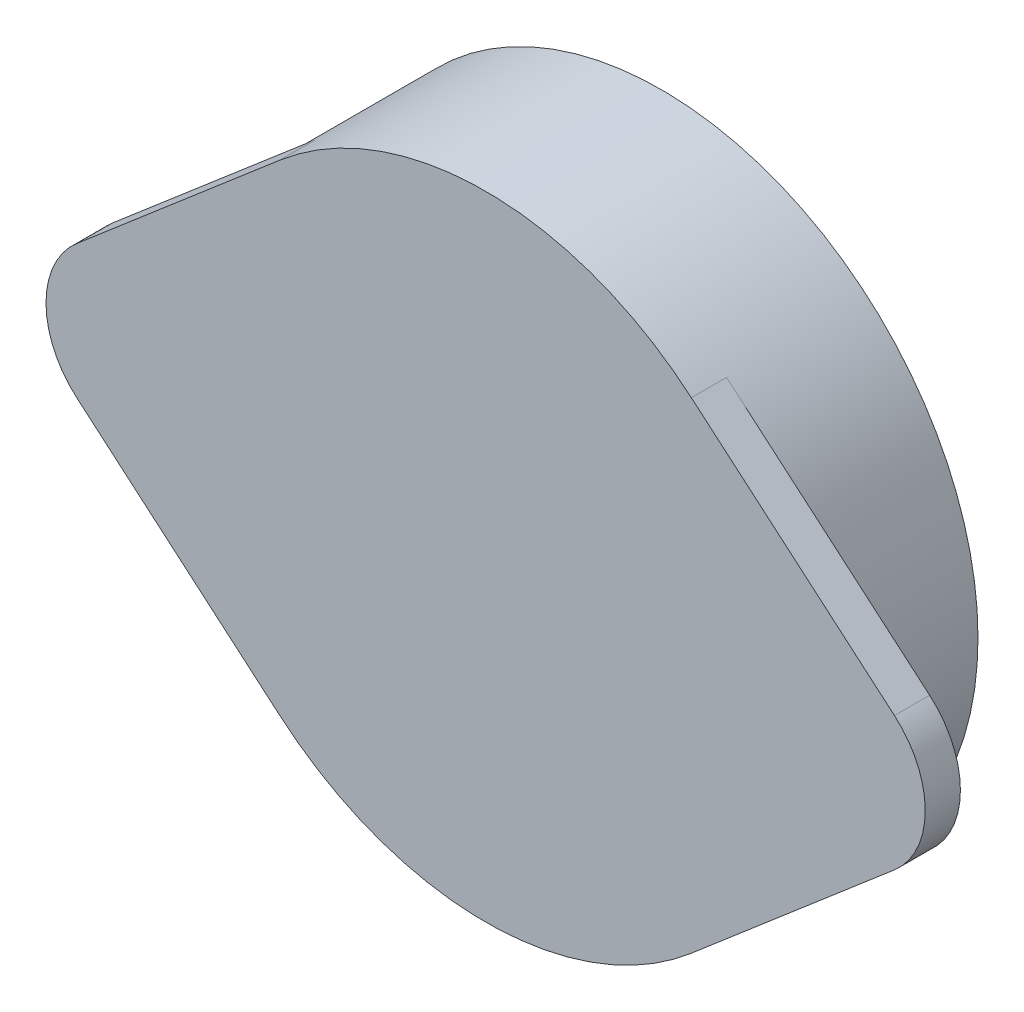
ISO-10303-21;
HEADER;
FILE_DESCRIPTION(('STEP AP214'),'2;1');
FILE_NAME('part.step','',(''),(''),'','','');
FILE_SCHEMA(('AUTOMOTIVE_DESIGN { 1 0 10303 214 1 1 1 1 }'));
ENDSEC;
DATA;
#1=APPLICATION_CONTEXT('core data for automotive mechanical design processes');
#2=APPLICATION_PROTOCOL_DEFINITION('international standard','automotive_design',2000,#1);
#3=PRODUCT_CONTEXT('',#1,'mechanical');
#4=PRODUCT('Part','Part','',(#3));
#5=PRODUCT_RELATED_PRODUCT_CATEGORY('part','',(#4));
#6=PRODUCT_DEFINITION_FORMATION('','',#4);
#7=PRODUCT_DEFINITION_CONTEXT('part definition',#1,'design');
#8=PRODUCT_DEFINITION('design','',#6,#7);
#9=PRODUCT_DEFINITION_SHAPE('','',#8);
#10=(LENGTH_UNIT() NAMED_UNIT(*) SI_UNIT(.MILLI.,.METRE.));
#11=(NAMED_UNIT(*) PLANE_ANGLE_UNIT() SI_UNIT($,.RADIAN.));
#12=(NAMED_UNIT(*) SI_UNIT($,.STERADIAN.) SOLID_ANGLE_UNIT());
#13=UNCERTAINTY_MEASURE_WITH_UNIT(LENGTH_MEASURE(1.E-05),#10,'distance_accuracy_value','');
#14=(GEOMETRIC_REPRESENTATION_CONTEXT(3) GLOBAL_UNCERTAINTY_ASSIGNED_CONTEXT((#13)) GLOBAL_UNIT_ASSIGNED_CONTEXT((#10,
#11,#12)) REPRESENTATION_CONTEXT('',''));
#15=CARTESIAN_POINT('',(0.,0.,0.));
#16=DIRECTION('',(0.,0.,1.));
#17=DIRECTION('',(1.,0.,0.));
#18=AXIS2_PLACEMENT_3D('',#15,#16,#17);
#19=CARTESIAN_POINT('',(0.,0.,-10.));
#20=DIRECTION('',(0.,0.,1.));
#21=DIRECTION('',(1.,0.,0.));
#22=AXIS2_PLACEMENT_3D('',#19,#20,#21);
#23=CYLINDRICAL_SURFACE('',#22,16.);
#24=CARTESIAN_POINT('',(0.,0.,-10.));
#25=DIRECTION('',(0.,0.,1.));
#26=DIRECTION('',(1.,0.,0.));
#27=AXIS2_PLACEMENT_3D('',#24,#25,#26);
#28=CIRCLE('',#27,16.);
#29=CARTESIAN_POINT('',(16.,0.,-10.));
#30=VERTEX_POINT('',#29);
#31=EDGE_CURVE('E153',#30,#30,#28,.T.);
#32=ORIENTED_EDGE('',*,*,#31,.F.);
#33=EDGE_LOOP('',(#32));
#34=FACE_BOUND('',#33,.T.);
#35=CARTESIAN_POINT('',(0.,0.,-2.));
#36=DIRECTION('',(0.,0.,1.));
#37=DIRECTION('',(1.,0.,0.));
#38=AXIS2_PLACEMENT_3D('',#35,#36,#37);
#39=CIRCLE('',#38,16.);
#40=CARTESIAN_POINT('',(16.,0.,-2.));
#41=VERTEX_POINT('',#40);
#42=EDGE_CURVE('E11',#41,#41,#39,.F.);
#43=ORIENTED_EDGE('',*,*,#42,.F.);
#44=EDGE_LOOP('',(#43));
#45=FACE_BOUND('',#44,.T.);
#46=ADVANCED_FACE('F44',(#34,#45),#23,.F.);
#47=CARTESIAN_POINT('',(11.7,13.6788157382136,-2.));
#48=DIRECTION('',(0.65,0.759934207678533,0.));
#49=DIRECTION('',(-0.759934207678533,0.65,0.));
#50=AXIS2_PLACEMENT_3D('',#47,#48,#49);
#51=PLANE('',#50);
#52=DIRECTION('',(-0.759934207678533,0.65,0.));
#53=VECTOR('',#52,1.);
#54=CARTESIAN_POINT('',(11.7,13.6788157382136,0.));
#55=LINE('',#54,#53);
#56=CARTESIAN_POINT('',(23.25,3.79967103839267,0.));
#57=VERTEX_POINT('',#56);
#58=CARTESIAN_POINT('',(11.7,13.6788157382136,0.));
#59=VERTEX_POINT('',#58);
#60=EDGE_CURVE('E167',#57,#59,#55,.T.);
#61=ORIENTED_EDGE('',*,*,#60,.F.);
#62=DIRECTION('',(0.,0.,1.));
#63=VECTOR('',#62,1.);
#64=CARTESIAN_POINT('',(23.25,3.79967103839267,-2.));
#65=LINE('',#64,#63);
#66=CARTESIAN_POINT('',(23.25,3.79967103839267,-2.));
#67=VERTEX_POINT('',#66);
#68=EDGE_CURVE('E82',#67,#57,#65,.T.);
#69=ORIENTED_EDGE('',*,*,#68,.F.);
#70=DIRECTION('',(-0.759934207678533,0.65,0.));
#71=VECTOR('',#70,1.);
#72=CARTESIAN_POINT('',(11.7,13.6788157382136,-2.));
#73=LINE('',#72,#71);
#74=CARTESIAN_POINT('',(11.7,13.6788157382136,-2.));
#75=VERTEX_POINT('',#74);
#76=EDGE_CURVE('E166',#67,#75,#73,.T.);
#77=ORIENTED_EDGE('',*,*,#76,.T.);
#78=DIRECTION('',(0.,0.,1.));
#79=VECTOR('',#78,1.);
#80=CARTESIAN_POINT('',(11.7,13.6788157382136,-2.));
#81=LINE('',#80,#79);
#82=EDGE_CURVE('E52',#75,#59,#81,.T.);
#83=ORIENTED_EDGE('',*,*,#82,.T.);
#84=EDGE_LOOP('',(#61,#69,#77,#83));
#85=FACE_BOUND('',#84,.T.);
#86=ADVANCED_FACE('F200',(#85),#51,.T.);
#87=CARTESIAN_POINT('',(20.,0.,-2.));
#88=DIRECTION('',(0.,0.,1.));
#89=DIRECTION('',(1.,0.,0.));
#90=AXIS2_PLACEMENT_3D('',#87,#88,#89);
#91=CYLINDRICAL_SURFACE('',#90,5.);
#92=CARTESIAN_POINT('',(20.,0.,0.));
#93=DIRECTION('',(0.,0.,1.));
#94=DIRECTION('',(1.,0.,0.));
#95=AXIS2_PLACEMENT_3D('',#92,#93,#94);
#96=CIRCLE('',#95,5.);
#97=CARTESIAN_POINT('',(23.25,-3.79967103839267,0.));
#98=VERTEX_POINT('',#97);
#99=EDGE_CURVE('E173',#57,#98,#96,.F.);
#100=ORIENTED_EDGE('',*,*,#99,.T.);
#101=DIRECTION('',(0.,0.,1.));
#102=VECTOR('',#101,1.);
#103=CARTESIAN_POINT('',(23.25,-3.79967103839267,-2.));
#104=LINE('',#103,#102);
#105=CARTESIAN_POINT('',(23.25,-3.79967103839267,-2.));
#106=VERTEX_POINT('',#105);
#107=EDGE_CURVE('E182',#106,#98,#104,.T.);
#108=ORIENTED_EDGE('',*,*,#107,.F.);
#109=CARTESIAN_POINT('',(20.,0.,-2.));
#110=DIRECTION('',(0.,0.,1.));
#111=DIRECTION('',(1.,0.,0.));
#112=AXIS2_PLACEMENT_3D('',#109,#110,#111);
#113=CIRCLE('',#112,5.);
#114=EDGE_CURVE('E86',#67,#106,#113,.F.);
#115=ORIENTED_EDGE('',*,*,#114,.F.);
#116=ORIENTED_EDGE('',*,*,#68,.T.);
#117=EDGE_LOOP('',(#100,#108,#115,#116));
#118=FACE_BOUND('',#117,.T.);
#119=ADVANCED_FACE('F207',(#118),#91,.T.);
#120=CARTESIAN_POINT('',(11.7,-13.6788157382136,-2.));
#121=DIRECTION('',(-0.65,0.759934207678533,0.));
#122=DIRECTION('',(-0.759934207678533,-0.65,0.));
#123=AXIS2_PLACEMENT_3D('',#120,#121,#122);
#124=PLANE('',#123);
#125=DIRECTION('',(-0.759934207678533,-0.65,0.));
#126=VECTOR('',#125,1.);
#127=CARTESIAN_POINT('',(11.7,-13.6788157382136,0.));
#128=LINE('',#127,#126);
#129=CARTESIAN_POINT('',(11.7,-13.6788157382136,0.));
#130=VERTEX_POINT('',#129);
#131=EDGE_CURVE('E159',#98,#130,#128,.T.);
#132=ORIENTED_EDGE('',*,*,#131,.T.);
#133=DIRECTION('',(0.,0.,1.));
#134=VECTOR('',#133,1.);
#135=CARTESIAN_POINT('',(11.7,-13.6788157382136,-2.));
#136=LINE('',#135,#134);
#137=CARTESIAN_POINT('',(11.7,-13.6788157382136,-2.));
#138=VERTEX_POINT('',#137);
#139=EDGE_CURVE('E175',#138,#130,#136,.T.);
#140=ORIENTED_EDGE('',*,*,#139,.F.);
#141=DIRECTION('',(-0.759934207678533,-0.65,0.));
#142=VECTOR('',#141,1.);
#143=CARTESIAN_POINT('',(11.7,-13.6788157382136,-2.));
#144=LINE('',#143,#142);
#145=EDGE_CURVE('E164',#106,#138,#144,.T.);
#146=ORIENTED_EDGE('',*,*,#145,.F.);
#147=ORIENTED_EDGE('',*,*,#107,.T.);
#148=EDGE_LOOP('',(#132,#140,#146,#147));
#149=FACE_BOUND('',#148,.T.);
#150=ADVANCED_FACE('F50',(#149),#124,.F.);
#151=CARTESIAN_POINT('',(0.,0.,-2.));
#152=DIRECTION('',(0.,0.,1.));
#153=DIRECTION('',(1.,0.,0.));
#154=AXIS2_PLACEMENT_3D('',#151,#152,#153);
#155=PLANE('',#154);
#156=CARTESIAN_POINT('',(0.,0.,-2.));
#157=DIRECTION('',(0.,0.,1.));
#158=DIRECTION('',(1.,0.,0.));
#159=AXIS2_PLACEMENT_3D('',#156,#157,#158);
#160=CIRCLE('',#159,18.);
#161=EDGE_CURVE('E162',#138,#75,#160,.T.);
#162=ORIENTED_EDGE('',*,*,#161,.T.);
#163=ORIENTED_EDGE('',*,*,#76,.F.);
#164=ORIENTED_EDGE('',*,*,#114,.T.);
#165=ORIENTED_EDGE('',*,*,#145,.T.);
#166=EDGE_LOOP('',(#162,#163,#164,#165));
#167=FACE_BOUND('',#166,.T.);
#168=ADVANCED_FACE('F199',(#167),#155,.F.);
#169=CARTESIAN_POINT('',(0.,0.,0.));
#170=DIRECTION('',(0.,0.,1.));
#171=DIRECTION('',(1.,0.,0.));
#172=AXIS2_PLACEMENT_3D('',#169,#170,#171);
#173=PLANE('',#172);
#174=ORIENTED_EDGE('',*,*,#60,.T.);
#175=CARTESIAN_POINT('',(0.,0.,0.));
#176=DIRECTION('',(0.,0.,1.));
#177=DIRECTION('',(1.,0.,0.));
#178=AXIS2_PLACEMENT_3D('',#175,#176,#177);
#179=CIRCLE('',#178,18.);
#180=CARTESIAN_POINT('',(-11.7,13.6788157382136,0.));
#181=VERTEX_POINT('',#180);
#182=EDGE_CURVE('E160',#59,#181,#179,.T.);
#183=ORIENTED_EDGE('',*,*,#182,.T.);
#184=DIRECTION('',(0.759934207678533,0.65,0.));
#185=VECTOR('',#184,1.);
#186=CARTESIAN_POINT('',(-11.7,13.6788157382136,0.));
#187=LINE('',#186,#185);
#188=CARTESIAN_POINT('',(-23.25,3.79967103839267,0.));
#189=VERTEX_POINT('',#188);
#190=EDGE_CURVE('E142',#189,#181,#187,.T.);
#191=ORIENTED_EDGE('',*,*,#190,.F.);
#192=CARTESIAN_POINT('',(-20.,0.,0.));
#193=DIRECTION('',(0.,0.,1.));
#194=DIRECTION('',(1.,0.,0.));
#195=AXIS2_PLACEMENT_3D('',#192,#193,#194);
#196=CIRCLE('',#195,5.);
#197=CARTESIAN_POINT('',(-23.25,-3.79967103839267,0.));
#198=VERTEX_POINT('',#197);
#199=EDGE_CURVE('E125',#189,#198,#196,.T.);
#200=ORIENTED_EDGE('',*,*,#199,.T.);
#201=DIRECTION('',(0.759934207678533,-0.65,0.));
#202=VECTOR('',#201,1.);
#203=CARTESIAN_POINT('',(-11.7,-13.6788157382136,0.));
#204=LINE('',#203,#202);
#205=CARTESIAN_POINT('',(-11.7,-13.6788157382136,0.));
#206=VERTEX_POINT('',#205);
#207=EDGE_CURVE('E144',#198,#206,#204,.T.);
#208=ORIENTED_EDGE('',*,*,#207,.T.);
#209=EDGE_CURVE('E147',#206,#130,#179,.T.);
#210=ORIENTED_EDGE('',*,*,#209,.T.);
#211=ORIENTED_EDGE('',*,*,#131,.F.);
#212=ORIENTED_EDGE('',*,*,#99,.F.);
#213=EDGE_LOOP('',(#174,#183,#191,#200,#208,#210,#211,#212));
#214=FACE_BOUND('',#213,.T.);
#215=ADVANCED_FACE('F194',(#214),#173,.T.);
#216=CARTESIAN_POINT('',(0.,0.,-10.));
#217=DIRECTION('',(0.,0.,1.));
#218=DIRECTION('',(1.,0.,0.));
#219=AXIS2_PLACEMENT_3D('',#216,#217,#218);
#220=CYLINDRICAL_SURFACE('',#219,18.);
#221=DIRECTION('',(0.,0.,1.));
#222=VECTOR('',#221,1.);
#223=CARTESIAN_POINT('',(-11.7,-13.6788157382136,-2.));
#224=LINE('',#223,#222);
#225=CARTESIAN_POINT('',(-11.7,-13.6788157382136,-2.));
#226=VERTEX_POINT('',#225);
#227=EDGE_CURVE('E146',#226,#206,#224,.T.);
#228=ORIENTED_EDGE('',*,*,#227,.F.);
#229=CARTESIAN_POINT('',(0.,0.,-2.));
#230=DIRECTION('',(0.,0.,1.));
#231=DIRECTION('',(1.,0.,0.));
#232=AXIS2_PLACEMENT_3D('',#229,#230,#231);
#233=CIRCLE('',#232,18.);
#234=CARTESIAN_POINT('',(-11.7,13.6788157382136,-2.));
#235=VERTEX_POINT('',#234);
#236=EDGE_CURVE('E134',#235,#226,#233,.T.);
#237=ORIENTED_EDGE('',*,*,#236,.F.);
#238=DIRECTION('',(0.,0.,1.));
#239=VECTOR('',#238,1.);
#240=CARTESIAN_POINT('',(-11.7,13.6788157382136,-2.));
#241=LINE('',#240,#239);
#242=EDGE_CURVE('E58',#235,#181,#241,.T.);
#243=ORIENTED_EDGE('',*,*,#242,.T.);
#244=ORIENTED_EDGE('',*,*,#182,.F.);
#245=ORIENTED_EDGE('',*,*,#82,.F.);
#246=ORIENTED_EDGE('',*,*,#161,.F.);
#247=ORIENTED_EDGE('',*,*,#139,.T.);
#248=ORIENTED_EDGE('',*,*,#209,.F.);
#249=EDGE_LOOP('',(#228,#237,#243,#244,#245,#246,#247,#248));
#250=FACE_BOUND('',#249,.T.);
#251=CARTESIAN_POINT('',(0.,0.,-10.));
#252=DIRECTION('',(0.,0.,1.));
#253=DIRECTION('',(1.,0.,0.));
#254=AXIS2_PLACEMENT_3D('',#251,#252,#253);
#255=CIRCLE('',#254,18.);
#256=CARTESIAN_POINT('',(18.,0.,-10.));
#257=VERTEX_POINT('',#256);
#258=EDGE_CURVE('E156',#257,#257,#255,.T.);
#259=ORIENTED_EDGE('',*,*,#258,.T.);
#260=EDGE_LOOP('',(#259));
#261=FACE_BOUND('',#260,.T.);
#262=ADVANCED_FACE('F190',(#250,#261),#220,.T.);
#263=CARTESIAN_POINT('',(0.,0.,-10.));
#264=DIRECTION('',(0.,0.,1.));
#265=DIRECTION('',(1.,0.,0.));
#266=AXIS2_PLACEMENT_3D('',#263,#264,#265);
#267=PLANE('',#266);
#268=ORIENTED_EDGE('',*,*,#31,.T.);
#269=EDGE_LOOP('',(#268));
#270=FACE_BOUND('',#269,.T.);
#271=ORIENTED_EDGE('',*,*,#258,.F.);
#272=EDGE_LOOP('',(#271));
#273=FACE_BOUND('',#272,.T.);
#274=ADVANCED_FACE('F225',(#270,#273),#267,.F.);
#275=CARTESIAN_POINT('',(-11.7,-13.6788157382136,-2.));
#276=DIRECTION('',(-0.65,-0.759934207678533,0.));
#277=DIRECTION('',(0.759934207678533,-0.65,0.));
#278=AXIS2_PLACEMENT_3D('',#275,#276,#277);
#279=PLANE('',#278);
#280=ORIENTED_EDGE('',*,*,#207,.F.);
#281=DIRECTION('',(0.,0.,1.));
#282=VECTOR('',#281,1.);
#283=CARTESIAN_POINT('',(-23.25,-3.79967103839267,-2.));
#284=LINE('',#283,#282);
#285=CARTESIAN_POINT('',(-23.25,-3.79967103839267,-2.));
#286=VERTEX_POINT('',#285);
#287=EDGE_CURVE('E130',#286,#198,#284,.T.);
#288=ORIENTED_EDGE('',*,*,#287,.F.);
#289=DIRECTION('',(0.759934207678533,-0.65,0.));
#290=VECTOR('',#289,1.);
#291=CARTESIAN_POINT('',(-11.7,-13.6788157382136,-2.));
#292=LINE('',#291,#290);
#293=EDGE_CURVE('E137',#286,#226,#292,.T.);
#294=ORIENTED_EDGE('',*,*,#293,.T.);
#295=ORIENTED_EDGE('',*,*,#227,.T.);
#296=EDGE_LOOP('',(#280,#288,#294,#295));
#297=FACE_BOUND('',#296,.T.);
#298=ADVANCED_FACE('F197',(#297),#279,.T.);
#299=CARTESIAN_POINT('',(-20.,0.,-2.));
#300=DIRECTION('',(0.,0.,1.));
#301=DIRECTION('',(1.,0.,0.));
#302=AXIS2_PLACEMENT_3D('',#299,#300,#301);
#303=CYLINDRICAL_SURFACE('',#302,5.);
#304=ORIENTED_EDGE('',*,*,#199,.F.);
#305=DIRECTION('',(0.,0.,1.));
#306=VECTOR('',#305,1.);
#307=CARTESIAN_POINT('',(-23.25,3.79967103839267,-2.));
#308=LINE('',#307,#306);
#309=CARTESIAN_POINT('',(-23.25,3.79967103839267,-2.));
#310=VERTEX_POINT('',#309);
#311=EDGE_CURVE('E116',#310,#189,#308,.T.);
#312=ORIENTED_EDGE('',*,*,#311,.F.);
#313=CARTESIAN_POINT('',(-20.,0.,-2.));
#314=DIRECTION('',(0.,0.,1.));
#315=DIRECTION('',(1.,0.,0.));
#316=AXIS2_PLACEMENT_3D('',#313,#314,#315);
#317=CIRCLE('',#316,5.);
#318=EDGE_CURVE('E122',#310,#286,#317,.T.);
#319=ORIENTED_EDGE('',*,*,#318,.T.);
#320=ORIENTED_EDGE('',*,*,#287,.T.);
#321=EDGE_LOOP('',(#304,#312,#319,#320));
#322=FACE_BOUND('',#321,.T.);
#323=ADVANCED_FACE('F118',(#322),#303,.T.);
#324=CARTESIAN_POINT('',(-11.7,13.6788157382136,-2.));
#325=DIRECTION('',(0.65,-0.759934207678533,0.));
#326=DIRECTION('',(0.759934207678533,0.65,0.));
#327=AXIS2_PLACEMENT_3D('',#324,#325,#326);
#328=PLANE('',#327);
#329=ORIENTED_EDGE('',*,*,#190,.T.);
#330=ORIENTED_EDGE('',*,*,#242,.F.);
#331=DIRECTION('',(0.759934207678533,0.65,0.));
#332=VECTOR('',#331,1.);
#333=CARTESIAN_POINT('',(-11.7,13.6788157382136,-2.));
#334=LINE('',#333,#332);
#335=EDGE_CURVE('E129',#310,#235,#334,.T.);
#336=ORIENTED_EDGE('',*,*,#335,.F.);
#337=ORIENTED_EDGE('',*,*,#311,.T.);
#338=EDGE_LOOP('',(#329,#330,#336,#337));
#339=FACE_BOUND('',#338,.T.);
#340=ADVANCED_FACE('F128',(#339),#328,.F.);
#341=CARTESIAN_POINT('',(0.,0.,-2.));
#342=DIRECTION('',(0.,0.,1.));
#343=DIRECTION('',(1.,0.,0.));
#344=AXIS2_PLACEMENT_3D('',#341,#342,#343);
#345=PLANE('',#344);
#346=ORIENTED_EDGE('',*,*,#236,.T.);
#347=ORIENTED_EDGE('',*,*,#293,.F.);
#348=ORIENTED_EDGE('',*,*,#318,.F.);
#349=ORIENTED_EDGE('',*,*,#335,.T.);
#350=EDGE_LOOP('',(#346,#347,#348,#349));
#351=FACE_BOUND('',#350,.T.);
#352=ADVANCED_FACE('F133',(#351),#345,.F.);
#353=CARTESIAN_POINT('',(0.,0.,-2.));
#354=DIRECTION('',(0.,0.,1.));
#355=DIRECTION('',(1.,0.,0.));
#356=AXIS2_PLACEMENT_3D('',#353,#354,#355);
#357=PLANE('',#356);
#358=ORIENTED_EDGE('',*,*,#42,.T.);
#359=EDGE_LOOP('',(#358));
#360=FACE_BOUND('',#359,.T.);
#361=ADVANCED_FACE('F234',(#360),#357,.F.);
#362=CLOSED_SHELL('',(#46,#86,#119,#150,#168,#215,#262,#274,#298,#323,#340,#352,#361));
#363=MANIFOLD_SOLID_BREP('B2',#362);
#364=ADVANCED_BREP_SHAPE_REPRESENTATION('',(#18,#363),#14);
#365=SHAPE_DEFINITION_REPRESENTATION(#9,#364);
ENDSEC;
END-ISO-10303-21;
